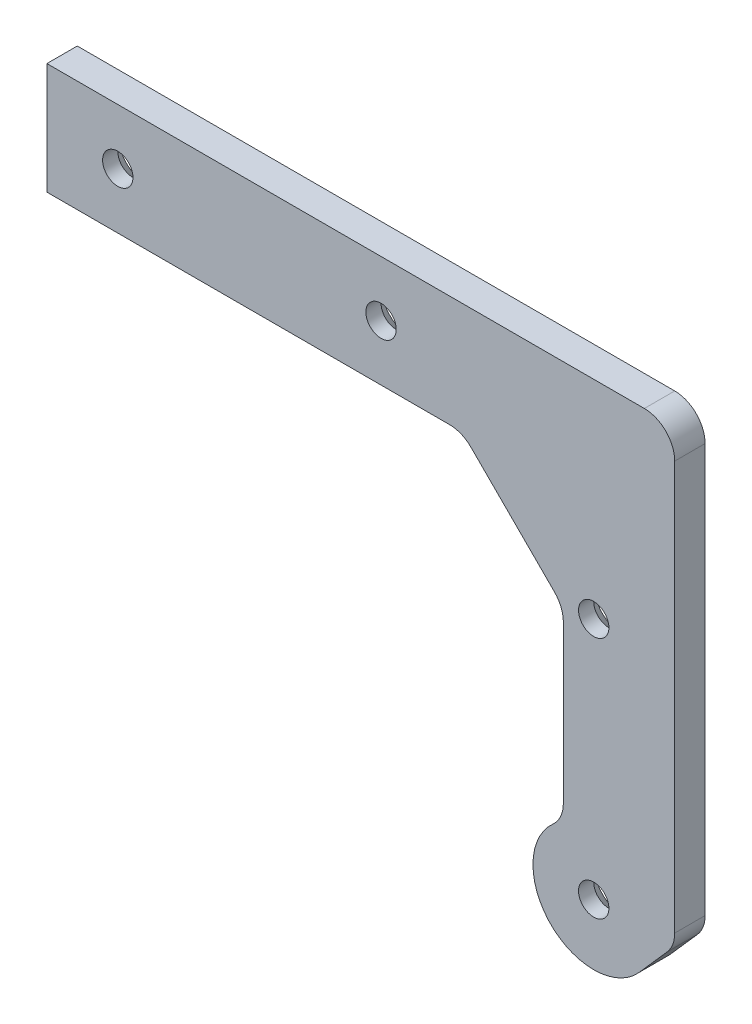
ISO-10303-21;
HEADER;
FILE_DESCRIPTION(('STEP AP214'),'2;1');
FILE_NAME('part.step','',(''),(''),'','','');
FILE_SCHEMA(('AUTOMOTIVE_DESIGN { 1 0 10303 214 1 1 1 1 }'));
ENDSEC;
DATA;
#1=APPLICATION_CONTEXT('core data for automotive mechanical design processes');
#2=APPLICATION_PROTOCOL_DEFINITION('international standard','automotive_design',2000,#1);
#3=PRODUCT_CONTEXT('',#1,'mechanical');
#4=PRODUCT('Part','Part','',(#3));
#5=PRODUCT_RELATED_PRODUCT_CATEGORY('part','',(#4));
#6=PRODUCT_DEFINITION_FORMATION('','',#4);
#7=PRODUCT_DEFINITION_CONTEXT('part definition',#1,'design');
#8=PRODUCT_DEFINITION('design','',#6,#7);
#9=PRODUCT_DEFINITION_SHAPE('','',#8);
#10=(LENGTH_UNIT() NAMED_UNIT(*) SI_UNIT(.MILLI.,.METRE.));
#11=(NAMED_UNIT(*) PLANE_ANGLE_UNIT() SI_UNIT($,.RADIAN.));
#12=(NAMED_UNIT(*) SI_UNIT($,.STERADIAN.) SOLID_ANGLE_UNIT());
#13=UNCERTAINTY_MEASURE_WITH_UNIT(LENGTH_MEASURE(1.E-05),#10,'distance_accuracy_value','');
#14=(GEOMETRIC_REPRESENTATION_CONTEXT(3) GLOBAL_UNCERTAINTY_ASSIGNED_CONTEXT((#13)) GLOBAL_UNIT_ASSIGNED_CONTEXT((#10,
#11,#12)) REPRESENTATION_CONTEXT('',''));
#15=CARTESIAN_POINT('',(0.,0.,0.));
#16=DIRECTION('',(0.,0.,1.));
#17=DIRECTION('',(1.,0.,0.));
#18=AXIS2_PLACEMENT_3D('',#15,#16,#17);
#19=CARTESIAN_POINT('',(-5.5,-5.50000000000001,3.));
#20=DIRECTION('',(1.,0.,0.));
#21=DIRECTION('',(0.,1.,0.));
#22=AXIS2_PLACEMENT_3D('',#19,#20,#21);
#23=PLANE('',#22);
#24=DIRECTION('',(0.,-1.,0.));
#25=VECTOR('',#24,1.);
#26=CARTESIAN_POINT('',(-5.5,-5.50000000000001,0.));
#27=LINE('',#26,#25);
#28=CARTESIAN_POINT('',(-5.49999999999999,-16.7426406871194,0.));
#29=VERTEX_POINT('',#28);
#30=CARTESIAN_POINT('',(-5.49999999999999,-32.2917960675006,0.));
#31=VERTEX_POINT('',#30);
#32=EDGE_CURVE('E199',#29,#31,#27,.T.);
#33=ORIENTED_EDGE('',*,*,#32,.T.);
#34=DIRECTION('',(0.,0.,1.));
#35=VECTOR('',#34,1.);
#36=CARTESIAN_POINT('',(-5.49999999999999,-32.2917960675006,3.));
#37=LINE('',#36,#35);
#38=CARTESIAN_POINT('',(-5.49999999999999,-32.2917960675006,3.));
#39=VERTEX_POINT('',#38);
#40=EDGE_CURVE('E217',#31,#39,#37,.T.);
#41=ORIENTED_EDGE('',*,*,#40,.T.);
#42=DIRECTION('',(0.,-1.,0.));
#43=VECTOR('',#42,1.);
#44=CARTESIAN_POINT('',(-5.5,-5.50000000000001,3.));
#45=LINE('',#44,#43);
#46=CARTESIAN_POINT('',(-5.49999999999999,-16.7426406871194,3.));
#47=VERTEX_POINT('',#46);
#48=EDGE_CURVE('E187',#47,#39,#45,.T.);
#49=ORIENTED_EDGE('',*,*,#48,.F.);
#50=DIRECTION('',(0.,0.,1.));
#51=VECTOR('',#50,1.);
#52=CARTESIAN_POINT('',(-5.49999999999999,-16.7426406871194,0.));
#53=LINE('',#52,#51);
#54=EDGE_CURVE('E214',#47,#29,#53,.F.);
#55=ORIENTED_EDGE('',*,*,#54,.T.);
#56=EDGE_LOOP('',(#33,#41,#49,#55));
#57=FACE_BOUND('',#56,.T.);
#58=ADVANCED_FACE('F39',(#57),#23,.F.);
#59=CARTESIAN_POINT('',(5.5,5.5,3.));
#60=DIRECTION('',(0.,-1.,0.));
#61=DIRECTION('',(1.,0.,0.));
#62=AXIS2_PLACEMENT_3D('',#59,#60,#61);
#63=PLANE('',#62);
#64=DIRECTION('',(-1.,0.,0.));
#65=VECTOR('',#64,1.);
#66=CARTESIAN_POINT('',(5.5,5.5,3.));
#67=LINE('',#66,#65);
#68=CARTESIAN_POINT('',(2.5,5.5,3.));
#69=VERTEX_POINT('',#68);
#70=CARTESIAN_POINT('',(-56.5,5.49999999999999,3.));
#71=VERTEX_POINT('',#70);
#72=EDGE_CURVE('E179',#69,#71,#67,.T.);
#73=ORIENTED_EDGE('',*,*,#72,.F.);
#74=DIRECTION('',(0.,0.,-1.));
#75=VECTOR('',#74,1.);
#76=CARTESIAN_POINT('',(2.5,5.5,3.));
#77=LINE('',#76,#75);
#78=CARTESIAN_POINT('',(2.5,5.5,0.));
#79=VERTEX_POINT('',#78);
#80=EDGE_CURVE('E240',#69,#79,#77,.T.);
#81=ORIENTED_EDGE('',*,*,#80,.T.);
#82=DIRECTION('',(-1.,0.,0.));
#83=VECTOR('',#82,1.);
#84=CARTESIAN_POINT('',(5.5,5.5,0.));
#85=LINE('',#84,#83);
#86=CARTESIAN_POINT('',(-56.5,5.49999999999999,0.));
#87=VERTEX_POINT('',#86);
#88=EDGE_CURVE('E178',#79,#87,#85,.T.);
#89=ORIENTED_EDGE('',*,*,#88,.T.);
#90=DIRECTION('',(0.,0.,-1.));
#91=VECTOR('',#90,1.);
#92=CARTESIAN_POINT('',(-56.5,5.49999999999999,3.));
#93=LINE('',#92,#91);
#94=EDGE_CURVE('E206',#71,#87,#93,.T.);
#95=ORIENTED_EDGE('',*,*,#94,.F.);
#96=EDGE_LOOP('',(#73,#81,#89,#95));
#97=FACE_BOUND('',#96,.T.);
#98=ADVANCED_FACE('F296',(#97),#63,.F.);
#99=CARTESIAN_POINT('',(-56.5,5.49999999999999,3.));
#100=DIRECTION('',(1.,0.,0.));
#101=DIRECTION('',(0.,0.,-1.));
#102=AXIS2_PLACEMENT_3D('',#99,#100,#101);
#103=PLANE('',#102);
#104=DIRECTION('',(0.,-1.,0.));
#105=VECTOR('',#104,1.);
#106=CARTESIAN_POINT('',(-56.5,5.49999999999999,0.));
#107=LINE('',#106,#105);
#108=CARTESIAN_POINT('',(-56.5,-5.50000000000001,0.));
#109=VERTEX_POINT('',#108);
#110=EDGE_CURVE('E195',#87,#109,#107,.T.);
#111=ORIENTED_EDGE('',*,*,#110,.T.);
#112=DIRECTION('',(0.,0.,-1.));
#113=VECTOR('',#112,1.);
#114=CARTESIAN_POINT('',(-56.5,-5.50000000000001,3.));
#115=LINE('',#114,#113);
#116=CARTESIAN_POINT('',(-56.5,-5.50000000000001,3.));
#117=VERTEX_POINT('',#116);
#118=EDGE_CURVE('E193',#117,#109,#115,.T.);
#119=ORIENTED_EDGE('',*,*,#118,.F.);
#120=DIRECTION('',(0.,-1.,0.));
#121=VECTOR('',#120,1.);
#122=CARTESIAN_POINT('',(-56.5,5.49999999999999,3.));
#123=LINE('',#122,#121);
#124=EDGE_CURVE('E181',#71,#117,#123,.T.);
#125=ORIENTED_EDGE('',*,*,#124,.F.);
#126=ORIENTED_EDGE('',*,*,#94,.T.);
#127=EDGE_LOOP('',(#111,#119,#125,#126));
#128=FACE_BOUND('',#127,.T.);
#129=ADVANCED_FACE('F302',(#128),#103,.F.);
#130=CARTESIAN_POINT('',(-56.5,-5.50000000000001,3.));
#131=DIRECTION('',(0.,1.,0.));
#132=DIRECTION('',(-1.,0.,0.));
#133=AXIS2_PLACEMENT_3D('',#130,#131,#132);
#134=PLANE('',#133);
#135=DIRECTION('',(1.,0.,0.));
#136=VECTOR('',#135,1.);
#137=CARTESIAN_POINT('',(-56.5,-5.50000000000001,0.));
#138=LINE('',#137,#136);
#139=CARTESIAN_POINT('',(-16.7426406871192,-5.50000000000001,0.));
#140=VERTEX_POINT('',#139);
#141=EDGE_CURVE('E197',#109,#140,#138,.T.);
#142=ORIENTED_EDGE('',*,*,#141,.T.);
#143=DIRECTION('',(0.,0.,-1.));
#144=VECTOR('',#143,1.);
#145=CARTESIAN_POINT('',(-16.7426406871192,-5.50000000000001,3.));
#146=LINE('',#145,#144);
#147=CARTESIAN_POINT('',(-16.7426406871192,-5.50000000000001,3.));
#148=VERTEX_POINT('',#147);
#149=EDGE_CURVE('E237',#140,#148,#146,.F.);
#150=ORIENTED_EDGE('',*,*,#149,.T.);
#151=DIRECTION('',(1.,0.,0.));
#152=VECTOR('',#151,1.);
#153=CARTESIAN_POINT('',(-56.5,-5.50000000000001,3.));
#154=LINE('',#153,#152);
#155=EDGE_CURVE('E184',#117,#148,#154,.T.);
#156=ORIENTED_EDGE('',*,*,#155,.F.);
#157=ORIENTED_EDGE('',*,*,#118,.T.);
#158=EDGE_LOOP('',(#142,#150,#156,#157));
#159=FACE_BOUND('',#158,.T.);
#160=ADVANCED_FACE('F308',(#159),#134,.F.);
#161=CARTESIAN_POINT('',(5.50000000000002,-46.5,3.));
#162=DIRECTION('',(-1.,0.,0.));
#163=DIRECTION('',(0.,-1.,0.));
#164=AXIS2_PLACEMENT_3D('',#161,#162,#163);
#165=PLANE('',#164);
#166=DIRECTION('',(0.,1.,0.));
#167=VECTOR('',#166,1.);
#168=CARTESIAN_POINT('',(5.50000000000002,-46.5,3.));
#169=LINE('',#168,#167);
#170=CARTESIAN_POINT('',(5.50000000000002,-37.8661065809723,3.));
#171=VERTEX_POINT('',#170);
#172=CARTESIAN_POINT('',(5.5,2.49999999999999,3.));
#173=VERTEX_POINT('',#172);
#174=EDGE_CURVE('E190',#171,#173,#169,.T.);
#175=ORIENTED_EDGE('',*,*,#174,.F.);
#176=DIRECTION('',(0.,0.,1.));
#177=VECTOR('',#176,1.);
#178=CARTESIAN_POINT('',(5.50000000000002,-37.8661065809723,3.));
#179=LINE('',#178,#177);
#180=CARTESIAN_POINT('',(5.50000000000002,-37.8661065809723,0.));
#181=VERTEX_POINT('',#180);
#182=EDGE_CURVE('E229',#171,#181,#179,.F.);
#183=ORIENTED_EDGE('',*,*,#182,.T.);
#184=DIRECTION('',(0.,1.,0.));
#185=VECTOR('',#184,1.);
#186=CARTESIAN_POINT('',(5.50000000000002,-46.5,0.));
#187=LINE('',#186,#185);
#188=CARTESIAN_POINT('',(5.5,2.49999999999999,0.));
#189=VERTEX_POINT('',#188);
#190=EDGE_CURVE('E182',#181,#189,#187,.T.);
#191=ORIENTED_EDGE('',*,*,#190,.T.);
#192=DIRECTION('',(0.,0.,-1.));
#193=VECTOR('',#192,1.);
#194=CARTESIAN_POINT('',(5.5,2.5,3.));
#195=LINE('',#194,#193);
#196=EDGE_CURVE('E227',#189,#173,#195,.F.);
#197=ORIENTED_EDGE('',*,*,#196,.T.);
#198=EDGE_LOOP('',(#175,#183,#191,#197));
#199=FACE_BOUND('',#198,.T.);
#200=ADVANCED_FACE('F307',(#199),#165,.F.);
#201=CARTESIAN_POINT('',(0.,0.,3.));
#202=DIRECTION('',(0.,0.,1.));
#203=DIRECTION('',(1.,0.,0.));
#204=AXIS2_PLACEMENT_3D('',#201,#202,#203);
#205=PLANE('',#204);
#206=DIRECTION('',(-0.661437827766149,-0.749999999999999,0.));
#207=VECTOR('',#206,1.);
#208=CARTESIAN_POINT('',(5.50000000000002,-39.,3.));
#209=LINE('',#208,#207);
#210=CARTESIAN_POINT('',(4.75000000000001,-39.8504200642708,3.));
#211=VERTEX_POINT('',#210);
#212=CARTESIAN_POINT('',(2.,-42.9686269665969,3.));
#213=VERTEX_POINT('',#212);
#214=EDGE_CURVE('E149',#211,#213,#209,.T.);
#215=ORIENTED_EDGE('',*,*,#214,.F.);
#216=CARTESIAN_POINT('',(2.50000000000002,-37.8661065809723,3.));
#217=DIRECTION('',(0.,0.,1.));
#218=DIRECTION('',(1.,0.,0.));
#219=AXIS2_PLACEMENT_3D('',#216,#217,#218);
#220=CIRCLE('',#219,3.);
#221=EDGE_CURVE('E225',#211,#171,#220,.T.);
#222=ORIENTED_EDGE('',*,*,#221,.T.);
#223=ORIENTED_EDGE('',*,*,#174,.T.);
#224=CARTESIAN_POINT('',(2.5,2.5,3.));
#225=DIRECTION('',(0.,0.,1.));
#226=DIRECTION('',(1.,0.,0.));
#227=AXIS2_PLACEMENT_3D('',#224,#225,#226);
#228=CIRCLE('',#227,3.);
#229=EDGE_CURVE('E223',#173,#69,#228,.T.);
#230=ORIENTED_EDGE('',*,*,#229,.T.);
#231=ORIENTED_EDGE('',*,*,#72,.T.);
#232=ORIENTED_EDGE('',*,*,#124,.T.);
#233=ORIENTED_EDGE('',*,*,#155,.T.);
#234=CARTESIAN_POINT('',(-16.7426406871192,-8.50000000000001,3.));
#235=DIRECTION('',(0.,0.,1.));
#236=DIRECTION('',(1.,0.,0.));
#237=AXIS2_PLACEMENT_3D('',#234,#235,#236);
#238=CIRCLE('',#237,3.);
#239=CARTESIAN_POINT('',(-14.6213203435596,-6.37867965644038,3.));
#240=VERTEX_POINT('',#239);
#241=EDGE_CURVE('E250',#148,#240,#238,.F.);
#242=ORIENTED_EDGE('',*,*,#241,.T.);
#243=DIRECTION('',(-0.707106781186543,0.707106781186552,0.));
#244=VECTOR('',#243,1.);
#245=CARTESIAN_POINT('',(-5.49999999999999,-15.5000000000001,3.));
#246=LINE('',#245,#244);
#247=CARTESIAN_POINT('',(-6.37867965644034,-14.6213203435597,3.));
#248=VERTEX_POINT('',#247);
#249=EDGE_CURVE('E211',#240,#248,#246,.F.);
#250=ORIENTED_EDGE('',*,*,#249,.T.);
#251=CARTESIAN_POINT('',(-8.49999999999999,-16.7426406871194,3.));
#252=DIRECTION('',(0.,0.,1.));
#253=DIRECTION('',(1.,0.,0.));
#254=AXIS2_PLACEMENT_3D('',#251,#252,#253);
#255=CIRCLE('',#254,3.);
#256=EDGE_CURVE('E248',#248,#47,#255,.F.);
#257=ORIENTED_EDGE('',*,*,#256,.T.);
#258=ORIENTED_EDGE('',*,*,#48,.T.);
#259=CARTESIAN_POINT('',(-8.49999999999999,-32.2917960675006,3.));
#260=DIRECTION('',(0.,0.,1.));
#261=DIRECTION('',(1.,0.,0.));
#262=AXIS2_PLACEMENT_3D('',#259,#260,#261);
#263=CIRCLE('',#262,3.);
#264=CARTESIAN_POINT('',(-6.49999999999999,-34.5278640450004,3.));
#265=VERTEX_POINT('',#264);
#266=EDGE_CURVE('E242',#39,#265,#263,.F.);
#267=ORIENTED_EDGE('',*,*,#266,.T.);
#268=CARTESIAN_POINT('',(-2.49999999999999,-39.,3.));
#269=DIRECTION('',(0.,0.,1.));
#270=DIRECTION('',(1.,0.,0.));
#271=AXIS2_PLACEMENT_3D('',#268,#269,#270);
#272=CIRCLE('',#271,6.);
#273=EDGE_CURVE('E158',#265,#213,#272,.T.);
#274=ORIENTED_EDGE('',*,*,#273,.T.);
#275=EDGE_LOOP('',(#215,#222,#223,#230,#231,#232,#233,#242,#250,#257,#258,#267,#274));
#276=FACE_BOUND('',#275,.T.);
#277=CARTESIAN_POINT('',(-49.5,0.,3.));
#278=DIRECTION('',(0.,0.,1.));
#279=DIRECTION('',(1.,0.,0.));
#280=AXIS2_PLACEMENT_3D('',#277,#278,#279);
#281=CIRCLE('',#280,1.5);
#282=CARTESIAN_POINT('',(-48.,0.,3.));
#283=VERTEX_POINT('',#282);
#284=EDGE_CURVE('E167',#283,#283,#281,.T.);
#285=ORIENTED_EDGE('',*,*,#284,.F.);
#286=EDGE_LOOP('',(#285));
#287=FACE_BOUND('',#286,.T.);
#288=CARTESIAN_POINT('',(-23.5,0.,3.));
#289=DIRECTION('',(0.,0.,1.));
#290=DIRECTION('',(1.,0.,0.));
#291=AXIS2_PLACEMENT_3D('',#288,#289,#290);
#292=CIRCLE('',#291,1.5);
#293=CARTESIAN_POINT('',(-22.,0.,3.));
#294=VERTEX_POINT('',#293);
#295=EDGE_CURVE('E171',#294,#294,#292,.T.);
#296=ORIENTED_EDGE('',*,*,#295,.F.);
#297=EDGE_LOOP('',(#296));
#298=FACE_BOUND('',#297,.T.);
#299=CARTESIAN_POINT('',(-2.5,-15.,3.));
#300=DIRECTION('',(0.,0.,1.));
#301=DIRECTION('',(1.,0.,0.));
#302=AXIS2_PLACEMENT_3D('',#299,#300,#301);
#303=CIRCLE('',#302,1.5);
#304=CARTESIAN_POINT('',(-0.999999999999995,-15.,3.));
#305=VERTEX_POINT('',#304);
#306=EDGE_CURVE('E170',#305,#305,#303,.T.);
#307=ORIENTED_EDGE('',*,*,#306,.F.);
#308=EDGE_LOOP('',(#307));
#309=FACE_BOUND('',#308,.T.);
#310=CARTESIAN_POINT('',(-2.49999999999999,-39.,3.));
#311=DIRECTION('',(0.,0.,1.));
#312=DIRECTION('',(1.,0.,0.));
#313=AXIS2_PLACEMENT_3D('',#310,#311,#312);
#314=CIRCLE('',#313,1.5);
#315=CARTESIAN_POINT('',(-0.999999999999992,-39.,3.));
#316=VERTEX_POINT('',#315);
#317=EDGE_CURVE('E157',#316,#316,#314,.T.);
#318=ORIENTED_EDGE('',*,*,#317,.F.);
#319=EDGE_LOOP('',(#318));
#320=FACE_BOUND('',#319,.T.);
#321=ADVANCED_FACE('F285',(#276,#287,#298,#309,#320),#205,.T.);
#322=CARTESIAN_POINT('',(0.,0.,0.));
#323=DIRECTION('',(0.,0.,1.));
#324=DIRECTION('',(1.,0.,0.));
#325=AXIS2_PLACEMENT_3D('',#322,#323,#324);
#326=PLANE('',#325);
#327=CARTESIAN_POINT('',(-2.49999999999999,-39.,0.));
#328=DIRECTION('',(0.,0.,1.));
#329=DIRECTION('',(1.,0.,0.));
#330=AXIS2_PLACEMENT_3D('',#327,#328,#329);
#331=CIRCLE('',#330,2.99999999999998);
#332=CARTESIAN_POINT('',(-5.49999999999997,-39.,0.));
#333=VERTEX_POINT('',#332);
#334=EDGE_CURVE('E262',#333,#333,#331,.T.);
#335=ORIENTED_EDGE('',*,*,#334,.T.);
#336=EDGE_LOOP('',(#335));
#337=FACE_BOUND('',#336,.T.);
#338=CARTESIAN_POINT('',(-2.5,-15.,0.));
#339=DIRECTION('',(0.,0.,1.));
#340=DIRECTION('',(1.,0.,0.));
#341=AXIS2_PLACEMENT_3D('',#338,#339,#340);
#342=CIRCLE('',#341,2.99999999999998);
#343=CARTESIAN_POINT('',(-5.49999999999997,-15.,0.));
#344=VERTEX_POINT('',#343);
#345=EDGE_CURVE('E259',#344,#344,#342,.T.);
#346=ORIENTED_EDGE('',*,*,#345,.T.);
#347=EDGE_LOOP('',(#346));
#348=FACE_BOUND('',#347,.T.);
#349=CARTESIAN_POINT('',(-23.5,0.,0.));
#350=DIRECTION('',(0.,0.,1.));
#351=DIRECTION('',(1.,0.,0.));
#352=AXIS2_PLACEMENT_3D('',#349,#350,#351);
#353=CIRCLE('',#352,3.00000000000001);
#354=CARTESIAN_POINT('',(-20.5,0.,0.));
#355=VERTEX_POINT('',#354);
#356=EDGE_CURVE('E256',#355,#355,#353,.T.);
#357=ORIENTED_EDGE('',*,*,#356,.T.);
#358=EDGE_LOOP('',(#357));
#359=FACE_BOUND('',#358,.T.);
#360=CARTESIAN_POINT('',(-49.5,0.,0.));
#361=DIRECTION('',(0.,0.,1.));
#362=DIRECTION('',(1.,0.,0.));
#363=AXIS2_PLACEMENT_3D('',#360,#361,#362);
#364=CIRCLE('',#363,3.00000000000001);
#365=CARTESIAN_POINT('',(-46.5,0.,0.));
#366=VERTEX_POINT('',#365);
#367=EDGE_CURVE('E253',#366,#366,#364,.T.);
#368=ORIENTED_EDGE('',*,*,#367,.T.);
#369=EDGE_LOOP('',(#368));
#370=FACE_BOUND('',#369,.T.);
#371=ORIENTED_EDGE('',*,*,#190,.F.);
#372=CARTESIAN_POINT('',(2.50000000000002,-37.8661065809723,0.));
#373=DIRECTION('',(0.,0.,1.));
#374=DIRECTION('',(1.,0.,0.));
#375=AXIS2_PLACEMENT_3D('',#372,#373,#374);
#376=CIRCLE('',#375,3.);
#377=CARTESIAN_POINT('',(4.75000000000001,-39.8504200642708,0.));
#378=VERTEX_POINT('',#377);
#379=EDGE_CURVE('E143',#181,#378,#376,.F.);
#380=ORIENTED_EDGE('',*,*,#379,.T.);
#381=DIRECTION('',(-0.661437827766149,-0.749999999999999,0.));
#382=VECTOR('',#381,1.);
#383=CARTESIAN_POINT('',(5.50000000000002,-39.,0.));
#384=LINE('',#383,#382);
#385=CARTESIAN_POINT('',(2.,-42.9686269665969,0.));
#386=VERTEX_POINT('',#385);
#387=EDGE_CURVE('E136',#378,#386,#384,.T.);
#388=ORIENTED_EDGE('',*,*,#387,.T.);
#389=CARTESIAN_POINT('',(-2.49999999999999,-39.,0.));
#390=DIRECTION('',(0.,0.,1.));
#391=DIRECTION('',(1.,0.,0.));
#392=AXIS2_PLACEMENT_3D('',#389,#390,#391);
#393=CIRCLE('',#392,6.);
#394=CARTESIAN_POINT('',(-6.49999999999999,-34.5278640450004,0.));
#395=VERTEX_POINT('',#394);
#396=EDGE_CURVE('E140',#386,#395,#393,.F.);
#397=ORIENTED_EDGE('',*,*,#396,.T.);
#398=CARTESIAN_POINT('',(-8.49999999999999,-32.2917960675006,0.));
#399=DIRECTION('',(0.,0.,1.));
#400=DIRECTION('',(1.,0.,0.));
#401=AXIS2_PLACEMENT_3D('',#398,#399,#400);
#402=CIRCLE('',#401,3.);
#403=EDGE_CURVE('E244',#395,#31,#402,.T.);
#404=ORIENTED_EDGE('',*,*,#403,.T.);
#405=ORIENTED_EDGE('',*,*,#32,.F.);
#406=CARTESIAN_POINT('',(-8.49999999999999,-16.7426406871194,0.));
#407=DIRECTION('',(0.,0.,1.));
#408=DIRECTION('',(1.,0.,0.));
#409=AXIS2_PLACEMENT_3D('',#406,#407,#408);
#410=CIRCLE('',#409,3.);
#411=CARTESIAN_POINT('',(-6.37867965644034,-14.6213203435597,0.));
#412=VERTEX_POINT('',#411);
#413=EDGE_CURVE('E246',#29,#412,#410,.T.);
#414=ORIENTED_EDGE('',*,*,#413,.T.);
#415=DIRECTION('',(0.707106781186543,-0.707106781186552,0.));
#416=VECTOR('',#415,1.);
#417=CARTESIAN_POINT('',(-10.5000000000001,-10.4999999999999,0.));
#418=LINE('',#417,#416);
#419=CARTESIAN_POINT('',(-14.6213203435596,-6.37867965644037,0.));
#420=VERTEX_POINT('',#419);
#421=EDGE_CURVE('E209',#412,#420,#418,.F.);
#422=ORIENTED_EDGE('',*,*,#421,.T.);
#423=CARTESIAN_POINT('',(-16.7426406871192,-8.50000000000001,0.));
#424=DIRECTION('',(0.,0.,1.));
#425=DIRECTION('',(1.,0.,0.));
#426=AXIS2_PLACEMENT_3D('',#423,#424,#425);
#427=CIRCLE('',#426,3.);
#428=EDGE_CURVE('E62',#420,#140,#427,.T.);
#429=ORIENTED_EDGE('',*,*,#428,.T.);
#430=ORIENTED_EDGE('',*,*,#141,.F.);
#431=ORIENTED_EDGE('',*,*,#110,.F.);
#432=ORIENTED_EDGE('',*,*,#88,.F.);
#433=CARTESIAN_POINT('',(2.5,2.5,0.));
#434=DIRECTION('',(0.,0.,1.));
#435=DIRECTION('',(1.,0.,0.));
#436=AXIS2_PLACEMENT_3D('',#433,#434,#435);
#437=CIRCLE('',#436,3.);
#438=EDGE_CURVE('E54',#79,#189,#437,.F.);
#439=ORIENTED_EDGE('',*,*,#438,.T.);
#440=EDGE_LOOP('',(#371,#380,#388,#397,#404,#405,#414,#422,#429,#430,#431,#432,#439));
#441=FACE_BOUND('',#440,.T.);
#442=ADVANCED_FACE('F139',(#337,#348,#359,#370,#441),#326,.F.);
#443=CARTESIAN_POINT('',(-2.5,-15.,0.));
#444=DIRECTION('',(0.,0.,1.));
#445=DIRECTION('',(1.,0.,0.));
#446=AXIS2_PLACEMENT_3D('',#443,#444,#445);
#447=CYLINDRICAL_SURFACE('',#446,1.5);
#448=CARTESIAN_POINT('',(-2.5,-15.,1.49999999999998));
#449=DIRECTION('',(0.,0.,1.));
#450=DIRECTION('',(1.,0.,0.));
#451=AXIS2_PLACEMENT_3D('',#448,#449,#450);
#452=CIRCLE('',#451,1.5);
#453=CARTESIAN_POINT('',(-3.99999999999999,-15.,1.49999999999998));
#454=VERTEX_POINT('',#453);
#455=EDGE_CURVE('E268',#454,#454,#452,.F.);
#456=ORIENTED_EDGE('',*,*,#455,.T.);
#457=EDGE_LOOP('',(#456));
#458=FACE_BOUND('',#457,.T.);
#459=ORIENTED_EDGE('',*,*,#306,.T.);
#460=EDGE_LOOP('',(#459));
#461=FACE_BOUND('',#460,.T.);
#462=ADVANCED_FACE('F284',(#458,#461),#447,.F.);
#463=CARTESIAN_POINT('',(-2.49999999999999,-39.,0.));
#464=DIRECTION('',(0.,0.,1.));
#465=DIRECTION('',(1.,0.,0.));
#466=AXIS2_PLACEMENT_3D('',#463,#464,#465);
#467=CYLINDRICAL_SURFACE('',#466,1.5);
#468=CARTESIAN_POINT('',(-2.49999999999999,-39.,1.49999999999998));
#469=DIRECTION('',(0.,0.,1.));
#470=DIRECTION('',(1.,0.,0.));
#471=AXIS2_PLACEMENT_3D('',#468,#469,#470);
#472=CIRCLE('',#471,1.5);
#473=CARTESIAN_POINT('',(-3.99999999999999,-39.,1.49999999999998));
#474=VERTEX_POINT('',#473);
#475=EDGE_CURVE('E265',#474,#474,#472,.F.);
#476=ORIENTED_EDGE('',*,*,#475,.T.);
#477=EDGE_LOOP('',(#476));
#478=FACE_BOUND('',#477,.T.);
#479=ORIENTED_EDGE('',*,*,#317,.T.);
#480=EDGE_LOOP('',(#479));
#481=FACE_BOUND('',#480,.T.);
#482=ADVANCED_FACE('F353',(#478,#481),#467,.F.);
#483=CARTESIAN_POINT('',(-23.5,0.,0.));
#484=DIRECTION('',(0.,0.,1.));
#485=DIRECTION('',(1.,0.,0.));
#486=AXIS2_PLACEMENT_3D('',#483,#484,#485);
#487=CYLINDRICAL_SURFACE('',#486,1.5);
#488=CARTESIAN_POINT('',(-23.5,0.,1.50000000000002));
#489=DIRECTION('',(0.,0.,1.));
#490=DIRECTION('',(1.,0.,0.));
#491=AXIS2_PLACEMENT_3D('',#488,#489,#490);
#492=CIRCLE('',#491,1.5);
#493=CARTESIAN_POINT('',(-22.,0.,1.50000000000002));
#494=VERTEX_POINT('',#493);
#495=EDGE_CURVE('E47',#494,#494,#492,.F.);
#496=ORIENTED_EDGE('',*,*,#495,.T.);
#497=EDGE_LOOP('',(#496));
#498=FACE_BOUND('',#497,.T.);
#499=ORIENTED_EDGE('',*,*,#295,.T.);
#500=EDGE_LOOP('',(#499));
#501=FACE_BOUND('',#500,.T.);
#502=ADVANCED_FACE('F273',(#498,#501),#487,.F.);
#503=CARTESIAN_POINT('',(-49.5,0.,0.));
#504=DIRECTION('',(0.,0.,1.));
#505=DIRECTION('',(1.,0.,0.));
#506=AXIS2_PLACEMENT_3D('',#503,#504,#505);
#507=CYLINDRICAL_SURFACE('',#506,1.5);
#508=CARTESIAN_POINT('',(-49.5,0.,1.50000000000002));
#509=DIRECTION('',(0.,0.,1.));
#510=DIRECTION('',(1.,0.,0.));
#511=AXIS2_PLACEMENT_3D('',#508,#509,#510);
#512=CIRCLE('',#511,1.5);
#513=CARTESIAN_POINT('',(-48.,0.,1.50000000000002));
#514=VERTEX_POINT('',#513);
#515=EDGE_CURVE('E11',#514,#514,#512,.F.);
#516=ORIENTED_EDGE('',*,*,#515,.T.);
#517=EDGE_LOOP('',(#516));
#518=FACE_BOUND('',#517,.T.);
#519=ORIENTED_EDGE('',*,*,#284,.T.);
#520=EDGE_LOOP('',(#519));
#521=FACE_BOUND('',#520,.T.);
#522=ADVANCED_FACE('F369',(#518,#521),#507,.F.);
#523=CARTESIAN_POINT('',(-2.49999999999999,-39.,-16.9705627484771));
#524=DIRECTION('',(0.,0.,1.));
#525=DIRECTION('',(1.,0.,0.));
#526=AXIS2_PLACEMENT_3D('',#523,#524,#525);
#527=CYLINDRICAL_SURFACE('',#526,6.);
#528=ORIENTED_EDGE('',*,*,#273,.F.);
#529=DIRECTION('',(0.,0.,1.));
#530=VECTOR('',#529,1.);
#531=CARTESIAN_POINT('',(-6.49999999999999,-34.5278640450004,-16.9705627484771));
#532=LINE('',#531,#530);
#533=EDGE_CURVE('E156',#265,#395,#532,.F.);
#534=ORIENTED_EDGE('',*,*,#533,.T.);
#535=ORIENTED_EDGE('',*,*,#396,.F.);
#536=DIRECTION('',(0.,0.,1.));
#537=VECTOR('',#536,1.);
#538=CARTESIAN_POINT('',(2.,-42.9686269665969,0.));
#539=LINE('',#538,#537);
#540=EDGE_CURVE('E148',#386,#213,#539,.T.);
#541=ORIENTED_EDGE('',*,*,#540,.T.);
#542=EDGE_LOOP('',(#528,#534,#535,#541));
#543=FACE_BOUND('',#542,.T.);
#544=ADVANCED_FACE('F154',(#543),#527,.T.);
#545=CARTESIAN_POINT('',(5.50000000000002,-39.,0.));
#546=DIRECTION('',(-0.749999999999999,0.661437827766149,0.));
#547=DIRECTION('',(-0.661437827766149,-0.749999999999999,0.));
#548=AXIS2_PLACEMENT_3D('',#545,#546,#547);
#549=PLANE('',#548);
#550=ORIENTED_EDGE('',*,*,#387,.F.);
#551=DIRECTION('',(0.,0.,1.));
#552=VECTOR('',#551,1.);
#553=CARTESIAN_POINT('',(4.75000000000001,-39.8504200642708,0.));
#554=LINE('',#553,#552);
#555=EDGE_CURVE('E221',#378,#211,#554,.T.);
#556=ORIENTED_EDGE('',*,*,#555,.T.);
#557=ORIENTED_EDGE('',*,*,#214,.T.);
#558=ORIENTED_EDGE('',*,*,#540,.F.);
#559=EDGE_LOOP('',(#550,#556,#557,#558));
#560=FACE_BOUND('',#559,.T.);
#561=ADVANCED_FACE('F160',(#560),#549,.F.);
#562=CARTESIAN_POINT('',(-5.49999999999999,-15.5000000000001,3.));
#563=DIRECTION('',(-0.707106781186551,-0.707106781186543,0.));
#564=DIRECTION('',(0.,0.,1.));
#565=AXIS2_PLACEMENT_3D('',#562,#563,#564);
#566=PLANE('',#565);
#567=ORIENTED_EDGE('',*,*,#421,.F.);
#568=DIRECTION('',(0.,0.,-1.));
#569=VECTOR('',#568,1.);
#570=CARTESIAN_POINT('',(-6.37867965644034,-14.6213203435597,3.));
#571=LINE('',#570,#569);
#572=EDGE_CURVE('E235',#412,#248,#571,.F.);
#573=ORIENTED_EDGE('',*,*,#572,.T.);
#574=ORIENTED_EDGE('',*,*,#249,.F.);
#575=DIRECTION('',(0.,0.,1.));
#576=VECTOR('',#575,1.);
#577=CARTESIAN_POINT('',(-14.6213203435596,-6.37867965644038,0.));
#578=LINE('',#577,#576);
#579=EDGE_CURVE('E233',#240,#420,#578,.F.);
#580=ORIENTED_EDGE('',*,*,#579,.T.);
#581=EDGE_LOOP('',(#567,#573,#574,#580));
#582=FACE_BOUND('',#581,.T.);
#583=ADVANCED_FACE('F315',(#582),#566,.T.);
#584=CARTESIAN_POINT('',(-8.49999999999999,-32.2917960675006,-16.9705627484771));
#585=DIRECTION('',(0.,0.,1.));
#586=DIRECTION('',(1.,0.,0.));
#587=AXIS2_PLACEMENT_3D('',#584,#585,#586);
#588=CYLINDRICAL_SURFACE('',#587,3.);
#589=ORIENTED_EDGE('',*,*,#403,.F.);
#590=ORIENTED_EDGE('',*,*,#533,.F.);
#591=ORIENTED_EDGE('',*,*,#266,.F.);
#592=ORIENTED_EDGE('',*,*,#40,.F.);
#593=EDGE_LOOP('',(#589,#590,#591,#592));
#594=FACE_BOUND('',#593,.T.);
#595=ADVANCED_FACE('F318',(#594),#588,.F.);
#596=CARTESIAN_POINT('',(2.50000000000002,-37.8661065809723,0.));
#597=DIRECTION('',(0.,0.,1.));
#598=DIRECTION('',(1.,0.,0.));
#599=AXIS2_PLACEMENT_3D('',#596,#597,#598);
#600=CYLINDRICAL_SURFACE('',#599,3.);
#601=ORIENTED_EDGE('',*,*,#379,.F.);
#602=ORIENTED_EDGE('',*,*,#182,.F.);
#603=ORIENTED_EDGE('',*,*,#221,.F.);
#604=ORIENTED_EDGE('',*,*,#555,.F.);
#605=EDGE_LOOP('',(#601,#602,#603,#604));
#606=FACE_BOUND('',#605,.T.);
#607=ADVANCED_FACE('F322',(#606),#600,.T.);
#608=CARTESIAN_POINT('',(-8.49999999999999,-16.7426406871194,3.));
#609=DIRECTION('',(0.,0.,-1.));
#610=DIRECTION('',(-1.,0.,0.));
#611=AXIS2_PLACEMENT_3D('',#608,#609,#610);
#612=CYLINDRICAL_SURFACE('',#611,3.);
#613=ORIENTED_EDGE('',*,*,#256,.F.);
#614=ORIENTED_EDGE('',*,*,#572,.F.);
#615=ORIENTED_EDGE('',*,*,#413,.F.);
#616=ORIENTED_EDGE('',*,*,#54,.F.);
#617=EDGE_LOOP('',(#613,#614,#615,#616));
#618=FACE_BOUND('',#617,.T.);
#619=ADVANCED_FACE('F326',(#618),#612,.F.);
#620=CARTESIAN_POINT('',(-16.7426406871192,-8.50000000000001,3.));
#621=DIRECTION('',(0.,0.,1.));
#622=DIRECTION('',(1.,0.,0.));
#623=AXIS2_PLACEMENT_3D('',#620,#621,#622);
#624=CYLINDRICAL_SURFACE('',#623,3.);
#625=ORIENTED_EDGE('',*,*,#428,.F.);
#626=ORIENTED_EDGE('',*,*,#579,.F.);
#627=ORIENTED_EDGE('',*,*,#241,.F.);
#628=ORIENTED_EDGE('',*,*,#149,.F.);
#629=EDGE_LOOP('',(#625,#626,#627,#628));
#630=FACE_BOUND('',#629,.T.);
#631=ADVANCED_FACE('F330',(#630),#624,.F.);
#632=CARTESIAN_POINT('',(2.5,2.5,3.));
#633=DIRECTION('',(0.,0.,-1.));
#634=DIRECTION('',(-1.,0.,0.));
#635=AXIS2_PLACEMENT_3D('',#632,#633,#634);
#636=CYLINDRICAL_SURFACE('',#635,3.);
#637=ORIENTED_EDGE('',*,*,#229,.F.);
#638=ORIENTED_EDGE('',*,*,#196,.F.);
#639=ORIENTED_EDGE('',*,*,#438,.F.);
#640=ORIENTED_EDGE('',*,*,#80,.F.);
#641=EDGE_LOOP('',(#637,#638,#639,#640));
#642=FACE_BOUND('',#641,.T.);
#643=ADVANCED_FACE('F334',(#642),#636,.T.);
#644=CARTESIAN_POINT('',(-2.49999999999999,-39.,0.));
#645=DIRECTION('',(0.,0.,-1.));
#646=DIRECTION('',(-1.,0.,0.));
#647=AXIS2_PLACEMENT_3D('',#644,#645,#646);
#648=CONICAL_SURFACE('',#647,2.99999999999998,0.785398163397445);
#649=CARTESIAN_POINT('',(-3.99999999999999,-39.,1.49999999999998));
#650=CARTESIAN_POINT('',(-4.01562499999999,-39.,1.48437499999998));
#651=CARTESIAN_POINT('',(-4.03124999999999,-39.,1.46874999999998));
#652=CARTESIAN_POINT('',(-4.06249999999999,-39.,1.43749999999998));
#653=CARTESIAN_POINT('',(-4.07812499999999,-39.,1.42187499999998));
#654=CARTESIAN_POINT('',(-4.10937499999999,-39.,1.39062499999998));
#655=CARTESIAN_POINT('',(-4.12499999999999,-39.,1.37499999999998));
#656=CARTESIAN_POINT('',(-4.15624999999999,-39.,1.34374999999998));
#657=CARTESIAN_POINT('',(-4.17187499999999,-39.,1.32812499999999));
#658=CARTESIAN_POINT('',(-4.20312499999999,-39.,1.29687499999999));
#659=CARTESIAN_POINT('',(-4.21874999999999,-39.,1.28124999999999));
#660=CARTESIAN_POINT('',(-4.24999999999999,-39.,1.24999999999999));
#661=CARTESIAN_POINT('',(-4.26562499999999,-39.,1.23437499999999));
#662=CARTESIAN_POINT('',(-4.29687499999999,-39.,1.20312499999999));
#663=CARTESIAN_POINT('',(-4.31249999999999,-39.,1.18749999999999));
#664=CARTESIAN_POINT('',(-4.34374999999999,-39.,1.15624999999999));
#665=CARTESIAN_POINT('',(-4.35937499999999,-39.,1.14062499999999));
#666=CARTESIAN_POINT('',(-4.39062499999999,-39.,1.10937499999999));
#667=CARTESIAN_POINT('',(-4.40624999999999,-39.,1.09374999999999));
#668=CARTESIAN_POINT('',(-4.43749999999999,-39.,1.06249999999999));
#669=CARTESIAN_POINT('',(-4.45312499999998,-39.,1.04687499999999));
#670=CARTESIAN_POINT('',(-4.48437499999998,-39.,1.01562499999999));
#671=CARTESIAN_POINT('',(-4.49999999999998,-39.,0.999999999999989));
#672=CARTESIAN_POINT('',(-4.53124999999998,-39.,0.968749999999989));
#673=CARTESIAN_POINT('',(-4.54687499999998,-39.,0.953124999999989));
#674=CARTESIAN_POINT('',(-4.57812499999998,-39.,0.92187499999999));
#675=CARTESIAN_POINT('',(-4.59374999999998,-39.,0.90624999999999));
#676=CARTESIAN_POINT('',(-4.62499999999998,-39.,0.87499999999999));
#677=CARTESIAN_POINT('',(-4.64062499999998,-39.,0.85937499999999));
#678=CARTESIAN_POINT('',(-4.67187499999998,-39.,0.828124999999991));
#679=CARTESIAN_POINT('',(-4.68749999999998,-39.,0.812499999999991));
#680=CARTESIAN_POINT('',(-4.71874999999998,-39.,0.781249999999991));
#681=CARTESIAN_POINT('',(-4.73437499999998,-39.,0.765624999999991));
#682=CARTESIAN_POINT('',(-4.76562499999998,-39.,0.734374999999992));
#683=CARTESIAN_POINT('',(-4.78124999999998,-39.,0.718749999999992));
#684=CARTESIAN_POINT('',(-4.81249999999998,-39.,0.687499999999992));
#685=CARTESIAN_POINT('',(-4.82812499999998,-39.,0.671874999999992));
#686=CARTESIAN_POINT('',(-4.85937499999998,-39.,0.640624999999993));
#687=CARTESIAN_POINT('',(-4.87499999999998,-39.,0.624999999999993));
#688=CARTESIAN_POINT('',(-4.90624999999998,-39.,0.593749999999993));
#689=CARTESIAN_POINT('',(-4.92187499999998,-39.,0.578124999999993));
#690=CARTESIAN_POINT('',(-4.95312499999998,-39.,0.546874999999994));
#691=CARTESIAN_POINT('',(-4.96874999999998,-39.,0.531249999999994));
#692=CARTESIAN_POINT('',(-4.99999999999998,-39.,0.499999999999995));
#693=CARTESIAN_POINT('',(-5.01562499999998,-39.,0.484374999999994));
#694=CARTESIAN_POINT('',(-5.04687499999998,-39.,0.453124999999995));
#695=CARTESIAN_POINT('',(-5.06249999999998,-39.,0.437499999999995));
#696=CARTESIAN_POINT('',(-5.09374999999998,-39.,0.406249999999996));
#697=CARTESIAN_POINT('',(-5.10937499999997,-39.,0.390624999999996));
#698=CARTESIAN_POINT('',(-5.14062499999997,-39.,0.359374999999996));
#699=CARTESIAN_POINT('',(-5.15624999999997,-39.,0.343749999999996));
#700=CARTESIAN_POINT('',(-5.18749999999997,-39.,0.312499999999997));
#701=CARTESIAN_POINT('',(-5.20312499999997,-39.,0.296874999999997));
#702=CARTESIAN_POINT('',(-5.23437499999997,-39.,0.265624999999997));
#703=CARTESIAN_POINT('',(-5.24999999999997,-39.,0.249999999999997));
#704=CARTESIAN_POINT('',(-5.28124999999997,-39.,0.218749999999998));
#705=CARTESIAN_POINT('',(-5.29687499999997,-39.,0.203124999999998));
#706=CARTESIAN_POINT('',(-5.32812499999997,-39.,0.171874999999998));
#707=CARTESIAN_POINT('',(-5.34374999999997,-39.,0.156249999999998));
#708=CARTESIAN_POINT('',(-5.37499999999997,-39.,0.124999999999999));
#709=CARTESIAN_POINT('',(-5.39062499999997,-39.,0.109374999999999));
#710=CARTESIAN_POINT('',(-5.42187499999997,-39.,0.0781249999999992));
#711=CARTESIAN_POINT('',(-5.43749999999997,-39.,0.0624999999999992));
#712=CARTESIAN_POINT('',(-5.46874999999997,-39.,0.0312499999999996));
#713=CARTESIAN_POINT('',(-5.48437499999997,-39.,0.0156249999999997));
#714=CARTESIAN_POINT('',(-5.49999999999997,-39.,0.));
#715=B_SPLINE_CURVE_WITH_KNOTS('',3,(#649,#650,#651,#652,#653,#654,#655,#656,#657,#658,#659,
#660,#661,#662,#663,#664,#665,#666,#667,#668,#669,#670,#671,#672,#673,#674,#675,#676,#677,#678,
#679,#680,#681,#682,#683,#684,#685,#686,#687,#688,#689,#690,#691,#692,#693,#694,#695,#696,#697,
#698,#699,#700,#701,#702,#703,#704,#705,#706,#707,#708,#709,#710,#711,#712,#713,#714),
.UNSPECIFIED.,.F.,.F.,(4,2,2,2,2,2,2,2,2,2,2,2,2,2,2,2,2,2,2,2,2,2,2,2,2,2,2,2,2,2,2,2,4),(0.,
0.0662912607362372,0.132582521472476,0.198873782208713,0.265165042944952,0.331456303681189,
0.397747564417427,0.464038825153665,0.530330085889903,0.596621346626141,0.662912607362379,
0.729203868098617,0.795495128834855,0.861786389571092,0.92807765030733,0.994368911043568,
1.06066017177981,1.12695143251604,1.19324269325228,1.25953395398852,1.32582521472476,
1.392116475461,1.45840773619723,1.52469899693347,1.59099025766971,1.65728151840595,
1.72357277914219,1.78986403987842,1.85615530061466,1.9224465613509,1.98873782208714,
2.05502908282338,2.12132034355961),.UNSPECIFIED.);
#716=EDGE_CURVE('BSEAM338',#474,#333,#715,.T.);
#717=ORIENTED_EDGE('',*,*,#475,.F.);
#718=ORIENTED_EDGE('',*,*,#334,.F.);
#719=ORIENTED_EDGE('',*,*,#716,.T.);
#720=ORIENTED_EDGE('',*,*,#716,.F.);
#721=EDGE_LOOP('',(#717,#719,#718,#720));
#722=FACE_BOUND('',#721,.T.);
#723=ADVANCED_FACE('F338',(#722),#648,.F.);
#724=CARTESIAN_POINT('',(-2.5,-15.,0.));
#725=DIRECTION('',(0.,0.,-1.));
#726=DIRECTION('',(-1.,0.,0.));
#727=AXIS2_PLACEMENT_3D('',#724,#725,#726);
#728=CONICAL_SURFACE('',#727,2.99999999999998,0.785398163397446);
#729=CARTESIAN_POINT('',(-3.99999999999999,-15.,1.49999999999998));
#730=CARTESIAN_POINT('',(-4.01562499999999,-15.,1.48437499999998));
#731=CARTESIAN_POINT('',(-4.03124999999999,-15.,1.46874999999998));
#732=CARTESIAN_POINT('',(-4.06249999999999,-15.,1.43749999999998));
#733=CARTESIAN_POINT('',(-4.07812499999999,-15.,1.42187499999998));
#734=CARTESIAN_POINT('',(-4.10937499999999,-15.,1.39062499999998));
#735=CARTESIAN_POINT('',(-4.12499999999999,-15.,1.37499999999999));
#736=CARTESIAN_POINT('',(-4.15624999999999,-15.,1.34374999999999));
#737=CARTESIAN_POINT('',(-4.17187499999999,-15.,1.32812499999999));
#738=CARTESIAN_POINT('',(-4.20312499999999,-15.,1.29687499999999));
#739=CARTESIAN_POINT('',(-4.21874999999999,-15.,1.28124999999999));
#740=CARTESIAN_POINT('',(-4.24999999999999,-15.,1.24999999999999));
#741=CARTESIAN_POINT('',(-4.26562499999999,-15.,1.23437499999999));
#742=CARTESIAN_POINT('',(-4.29687499999999,-15.,1.20312499999999));
#743=CARTESIAN_POINT('',(-4.31249999999999,-15.,1.18749999999999));
#744=CARTESIAN_POINT('',(-4.34374999999999,-15.,1.15624999999999));
#745=CARTESIAN_POINT('',(-4.35937499999999,-15.,1.14062499999999));
#746=CARTESIAN_POINT('',(-4.39062499999999,-15.,1.10937499999999));
#747=CARTESIAN_POINT('',(-4.40624999999999,-15.,1.09374999999999));
#748=CARTESIAN_POINT('',(-4.43749999999999,-15.,1.06249999999999));
#749=CARTESIAN_POINT('',(-4.45312499999999,-15.,1.04687499999999));
#750=CARTESIAN_POINT('',(-4.48437499999999,-15.,1.01562499999999));
#751=CARTESIAN_POINT('',(-4.49999999999999,-15.,0.999999999999989));
#752=CARTESIAN_POINT('',(-4.53124999999999,-15.,0.96874999999999));
#753=CARTESIAN_POINT('',(-4.54687499999999,-15.,0.95312499999999));
#754=CARTESIAN_POINT('',(-4.57812499999998,-15.,0.92187499999999));
#755=CARTESIAN_POINT('',(-4.59374999999998,-15.,0.90624999999999));
#756=CARTESIAN_POINT('',(-4.62499999999998,-15.,0.874999999999991));
#757=CARTESIAN_POINT('',(-4.64062499999998,-15.,0.859374999999991));
#758=CARTESIAN_POINT('',(-4.67187499999998,-15.,0.828124999999991));
#759=CARTESIAN_POINT('',(-4.68749999999998,-15.,0.812499999999991));
#760=CARTESIAN_POINT('',(-4.71874999999998,-15.,0.781249999999992));
#761=CARTESIAN_POINT('',(-4.73437499999998,-15.,0.765624999999992));
#762=CARTESIAN_POINT('',(-4.76562499999998,-15.,0.734374999999992));
#763=CARTESIAN_POINT('',(-4.78124999999998,-15.,0.718749999999992));
#764=CARTESIAN_POINT('',(-4.81249999999998,-15.,0.687499999999993));
#765=CARTESIAN_POINT('',(-4.82812499999998,-15.,0.671874999999993));
#766=CARTESIAN_POINT('',(-4.85937499999998,-15.,0.640624999999993));
#767=CARTESIAN_POINT('',(-4.87499999999998,-15.,0.624999999999993));
#768=CARTESIAN_POINT('',(-4.90624999999998,-15.,0.593749999999994));
#769=CARTESIAN_POINT('',(-4.92187499999998,-15.,0.578124999999994));
#770=CARTESIAN_POINT('',(-4.95312499999998,-15.,0.546874999999994));
#771=CARTESIAN_POINT('',(-4.96874999999998,-15.,0.531249999999994));
#772=CARTESIAN_POINT('',(-4.99999999999998,-15.,0.499999999999995));
#773=CARTESIAN_POINT('',(-5.01562499999998,-15.,0.484374999999995));
#774=CARTESIAN_POINT('',(-5.04687499999998,-15.,0.453124999999995));
#775=CARTESIAN_POINT('',(-5.06249999999998,-15.,0.437499999999995));
#776=CARTESIAN_POINT('',(-5.09374999999998,-15.,0.406249999999996));
#777=CARTESIAN_POINT('',(-5.10937499999998,-15.,0.390624999999996));
#778=CARTESIAN_POINT('',(-5.14062499999998,-15.,0.359374999999996));
#779=CARTESIAN_POINT('',(-5.15624999999998,-15.,0.343749999999996));
#780=CARTESIAN_POINT('',(-5.18749999999998,-15.,0.312499999999996));
#781=CARTESIAN_POINT('',(-5.20312499999998,-15.,0.296874999999997));
#782=CARTESIAN_POINT('',(-5.23437499999998,-15.,0.265624999999997));
#783=CARTESIAN_POINT('',(-5.24999999999997,-15.,0.249999999999997));
#784=CARTESIAN_POINT('',(-5.28124999999997,-15.,0.218749999999998));
#785=CARTESIAN_POINT('',(-5.29687499999997,-15.,0.203124999999998));
#786=CARTESIAN_POINT('',(-5.32812499999997,-15.,0.171874999999998));
#787=CARTESIAN_POINT('',(-5.34374999999997,-15.,0.156249999999998));
#788=CARTESIAN_POINT('',(-5.37499999999997,-15.,0.124999999999999));
#789=CARTESIAN_POINT('',(-5.39062499999997,-15.,0.109374999999999));
#790=CARTESIAN_POINT('',(-5.42187499999997,-15.,0.0781249999999992));
#791=CARTESIAN_POINT('',(-5.43749999999997,-15.,0.0624999999999994));
#792=CARTESIAN_POINT('',(-5.46874999999997,-15.,0.0312499999999998));
#793=CARTESIAN_POINT('',(-5.48437499999997,-15.,0.0156249999999999));
#794=CARTESIAN_POINT('',(-5.49999999999997,-15.,0.));
#795=B_SPLINE_CURVE_WITH_KNOTS('',3,(#729,#730,#731,#732,#733,#734,#735,#736,#737,#738,#739,
#740,#741,#742,#743,#744,#745,#746,#747,#748,#749,#750,#751,#752,#753,#754,#755,#756,#757,#758,
#759,#760,#761,#762,#763,#764,#765,#766,#767,#768,#769,#770,#771,#772,#773,#774,#775,#776,#777,
#778,#779,#780,#781,#782,#783,#784,#785,#786,#787,#788,#789,#790,#791,#792,#793,#794),
.UNSPECIFIED.,.F.,.F.,(4,2,2,2,2,2,2,2,2,2,2,2,2,2,2,2,2,2,2,2,2,2,2,2,2,2,2,2,2,2,2,2,4),(0.,
0.066291260736238,0.132582521472476,0.198873782208714,0.265165042944952,0.33145630368119,
0.397747564417427,0.464038825153665,0.530330085889903,0.596621346626142,0.662912607362379,
0.729203868098617,0.795495128834855,0.861786389571093,0.928077650307331,0.994368911043569,
1.06066017177981,1.12695143251604,1.19324269325228,1.25953395398852,1.32582521472476,
1.392116475461,1.45840773619723,1.52469899693347,1.59099025766971,1.65728151840595,
1.72357277914219,1.78986403987842,1.85615530061466,1.9224465613509,1.98873782208714,
2.05502908282338,2.12132034355961),.UNSPECIFIED.);
#796=EDGE_CURVE('BSEAM279',#454,#344,#795,.T.);
#797=ORIENTED_EDGE('',*,*,#455,.F.);
#798=ORIENTED_EDGE('',*,*,#345,.F.);
#799=ORIENTED_EDGE('',*,*,#796,.T.);
#800=ORIENTED_EDGE('',*,*,#796,.F.);
#801=EDGE_LOOP('',(#797,#799,#798,#800));
#802=FACE_BOUND('',#801,.T.);
#803=ADVANCED_FACE('F279',(#802),#728,.F.);
#804=CARTESIAN_POINT('',(-23.5,0.,0.));
#805=DIRECTION('',(0.,0.,-1.));
#806=DIRECTION('',(-1.,0.,0.));
#807=AXIS2_PLACEMENT_3D('',#804,#805,#806);
#808=CONICAL_SURFACE('',#807,3.00000000000001,0.785398163397444);
#809=ORIENTED_EDGE('',*,*,#495,.F.);
#810=EDGE_LOOP('',(#809));
#811=FACE_BOUND('',#810,.T.);
#812=ORIENTED_EDGE('',*,*,#356,.F.);
#813=EDGE_LOOP('',(#812));
#814=FACE_BOUND('',#813,.T.);
#815=ADVANCED_FACE('F276',(#811,#814),#808,.F.);
#816=CARTESIAN_POINT('',(-49.5,0.,0.));
#817=DIRECTION('',(0.,0.,-1.));
#818=DIRECTION('',(-1.,0.,0.));
#819=AXIS2_PLACEMENT_3D('',#816,#817,#818);
#820=CONICAL_SURFACE('',#819,3.00000000000001,0.785398163397444);
#821=ORIENTED_EDGE('',*,*,#515,.F.);
#822=EDGE_LOOP('',(#821));
#823=FACE_BOUND('',#822,.T.);
#824=ORIENTED_EDGE('',*,*,#367,.F.);
#825=EDGE_LOOP('',(#824));
#826=FACE_BOUND('',#825,.T.);
#827=ADVANCED_FACE('F41',(#823,#826),#820,.F.);
#828=CLOSED_SHELL('',(#58,#98,#129,#160,#200,#321,#442,#462,#482,#502,#522,#544,#561,#583,#595,
#607,#619,#631,#643,#723,#803,#815,#827));
#829=MANIFOLD_SOLID_BREP('B2',#828);
#830=ADVANCED_BREP_SHAPE_REPRESENTATION('',(#18,#829),#14);
#831=SHAPE_DEFINITION_REPRESENTATION(#9,#830);
ENDSEC;
END-ISO-10303-21;
